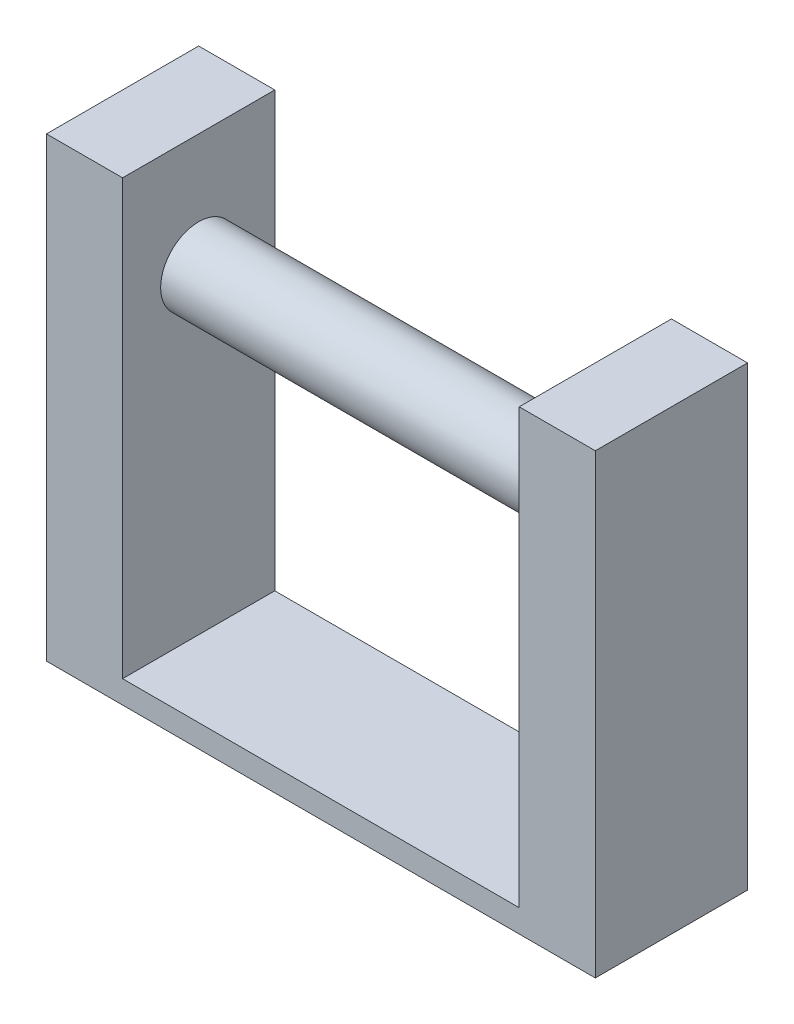
ISO-10303-21;
HEADER;
FILE_DESCRIPTION(('STEP AP214'),'2;1');
FILE_NAME('part.step','',(''),(''),'','','');
FILE_SCHEMA(('AUTOMOTIVE_DESIGN { 1 0 10303 214 1 1 1 1 }'));
ENDSEC;
DATA;
#1=APPLICATION_CONTEXT('core data for automotive mechanical design processes');
#2=APPLICATION_PROTOCOL_DEFINITION('international standard','automotive_design',2000,#1);
#3=PRODUCT_CONTEXT('',#1,'mechanical');
#4=PRODUCT('Part','Part','',(#3));
#5=PRODUCT_RELATED_PRODUCT_CATEGORY('part','',(#4));
#6=PRODUCT_DEFINITION_FORMATION('','',#4);
#7=PRODUCT_DEFINITION_CONTEXT('part definition',#1,'design');
#8=PRODUCT_DEFINITION('design','',#6,#7);
#9=PRODUCT_DEFINITION_SHAPE('','',#8);
#10=(LENGTH_UNIT() NAMED_UNIT(*) SI_UNIT(.MILLI.,.METRE.));
#11=(NAMED_UNIT(*) PLANE_ANGLE_UNIT() SI_UNIT($,.RADIAN.));
#12=(NAMED_UNIT(*) SI_UNIT($,.STERADIAN.) SOLID_ANGLE_UNIT());
#13=UNCERTAINTY_MEASURE_WITH_UNIT(LENGTH_MEASURE(1.E-05),#10,'distance_accuracy_value','');
#14=(GEOMETRIC_REPRESENTATION_CONTEXT(3) GLOBAL_UNCERTAINTY_ASSIGNED_CONTEXT((#13)) GLOBAL_UNIT_ASSIGNED_CONTEXT((#10,
#11,#12)) REPRESENTATION_CONTEXT('',''));
#15=CARTESIAN_POINT('',(0.,0.,0.));
#16=DIRECTION('',(0.,0.,1.));
#17=DIRECTION('',(1.,0.,0.));
#18=AXIS2_PLACEMENT_3D('',#15,#16,#17);
#19=CARTESIAN_POINT('',(-41.6981911266425,23.0571240586059,20.));
#20=DIRECTION('',(0.,-1.,0.));
#21=DIRECTION('',(0.,0.,-1.));
#22=AXIS2_PLACEMENT_3D('',#19,#20,#21);
#23=PLANE('',#22);
#24=DIRECTION('',(-1.,0.,0.));
#25=VECTOR('',#24,1.);
#26=CARTESIAN_POINT('',(-41.6981911266425,23.0571240586059,0.));
#27=LINE('',#26,#25);
#28=CARTESIAN_POINT('',(-41.6981911266425,23.0571240586059,0.));
#29=VERTEX_POINT('',#28);
#30=CARTESIAN_POINT('',(-51.6981911266425,23.0571240586059,0.));
#31=VERTEX_POINT('',#30);
#32=EDGE_CURVE('E130',#29,#31,#27,.T.);
#33=ORIENTED_EDGE('',*,*,#32,.T.);
#34=DIRECTION('',(0.,0.,-1.));
#35=VECTOR('',#34,1.);
#36=CARTESIAN_POINT('',(-51.6981911266425,23.0571240586059,20.));
#37=LINE('',#36,#35);
#38=CARTESIAN_POINT('',(-51.6981911266425,23.0571240586059,20.));
#39=VERTEX_POINT('',#38);
#40=EDGE_CURVE('E11',#39,#31,#37,.T.);
#41=ORIENTED_EDGE('',*,*,#40,.F.);
#42=DIRECTION('',(-1.,0.,0.));
#43=VECTOR('',#42,1.);
#44=CARTESIAN_POINT('',(-41.6981911266425,23.0571240586059,20.));
#45=LINE('',#44,#43);
#46=CARTESIAN_POINT('',(-41.6981911266425,23.0571240586059,20.));
#47=VERTEX_POINT('',#46);
#48=EDGE_CURVE('E145',#47,#39,#45,.T.);
#49=ORIENTED_EDGE('',*,*,#48,.F.);
#50=DIRECTION('',(0.,0.,-1.));
#51=VECTOR('',#50,1.);
#52=CARTESIAN_POINT('',(-41.6981911266425,23.0571240586059,20.));
#53=LINE('',#52,#51);
#54=EDGE_CURVE('E126',#47,#29,#53,.T.);
#55=ORIENTED_EDGE('',*,*,#54,.T.);
#56=EDGE_LOOP('',(#33,#41,#49,#55));
#57=FACE_BOUND('',#56,.T.);
#58=ADVANCED_FACE('F33',(#57),#23,.F.);
#59=CARTESIAN_POINT('',(-51.6981911266425,23.0571240586059,20.));
#60=DIRECTION('',(1.,0.,0.));
#61=DIRECTION('',(0.,1.,0.));
#62=AXIS2_PLACEMENT_3D('',#59,#60,#61);
#63=PLANE('',#62);
#64=DIRECTION('',(0.,-1.,0.));
#65=VECTOR('',#64,1.);
#66=CARTESIAN_POINT('',(-51.6981911266425,23.0571240586059,0.));
#67=LINE('',#66,#65);
#68=CARTESIAN_POINT('',(-51.6981911266425,-36.942875941394,0.));
#69=VERTEX_POINT('',#68);
#70=EDGE_CURVE('E133',#31,#69,#67,.T.);
#71=ORIENTED_EDGE('',*,*,#70,.T.);
#72=DIRECTION('',(0.,0.,-1.));
#73=VECTOR('',#72,1.);
#74=CARTESIAN_POINT('',(-51.6981911266425,-36.942875941394,20.));
#75=LINE('',#74,#73);
#76=CARTESIAN_POINT('',(-51.6981911266425,-36.942875941394,20.));
#77=VERTEX_POINT('',#76);
#78=EDGE_CURVE('E42',#77,#69,#75,.T.);
#79=ORIENTED_EDGE('',*,*,#78,.F.);
#80=DIRECTION('',(0.,-1.,0.));
#81=VECTOR('',#80,1.);
#82=CARTESIAN_POINT('',(-51.6981911266425,23.0571240586059,20.));
#83=LINE('',#82,#81);
#84=EDGE_CURVE('E93',#39,#77,#83,.T.);
#85=ORIENTED_EDGE('',*,*,#84,.F.);
#86=ORIENTED_EDGE('',*,*,#40,.T.);
#87=EDGE_LOOP('',(#71,#79,#85,#86));
#88=FACE_BOUND('',#87,.T.);
#89=ADVANCED_FACE('F197',(#88),#63,.F.);
#90=CARTESIAN_POINT('',(-51.6981911266425,-36.942875941394,20.));
#91=DIRECTION('',(0.,1.,0.));
#92=DIRECTION('',(0.,0.,1.));
#93=AXIS2_PLACEMENT_3D('',#90,#91,#92);
#94=PLANE('',#93);
#95=DIRECTION('',(1.,0.,0.));
#96=VECTOR('',#95,1.);
#97=CARTESIAN_POINT('',(-51.6981911266425,-36.942875941394,0.));
#98=LINE('',#97,#96);
#99=CARTESIAN_POINT('',(20.4223877168278,-36.942875941394,0.));
#100=VERTEX_POINT('',#99);
#101=EDGE_CURVE('E136',#69,#100,#98,.T.);
#102=ORIENTED_EDGE('',*,*,#101,.T.);
#103=DIRECTION('',(0.,0.,-1.));
#104=VECTOR('',#103,1.);
#105=CARTESIAN_POINT('',(20.4223877168278,-36.942875941394,20.));
#106=LINE('',#105,#104);
#107=CARTESIAN_POINT('',(20.4223877168278,-36.942875941394,20.));
#108=VERTEX_POINT('',#107);
#109=EDGE_CURVE('E152',#108,#100,#106,.T.);
#110=ORIENTED_EDGE('',*,*,#109,.F.);
#111=DIRECTION('',(1.,0.,0.));
#112=VECTOR('',#111,1.);
#113=CARTESIAN_POINT('',(-51.6981911266425,-36.942875941394,20.));
#114=LINE('',#113,#112);
#115=EDGE_CURVE('E161',#77,#108,#114,.T.);
#116=ORIENTED_EDGE('',*,*,#115,.F.);
#117=ORIENTED_EDGE('',*,*,#78,.T.);
#118=EDGE_LOOP('',(#102,#110,#116,#117));
#119=FACE_BOUND('',#118,.T.);
#120=ADVANCED_FACE('F159',(#119),#94,.F.);
#121=CARTESIAN_POINT('',(20.4223877168278,-36.942875941394,20.));
#122=DIRECTION('',(-1.,0.,0.));
#123=DIRECTION('',(0.,0.,1.));
#124=AXIS2_PLACEMENT_3D('',#121,#122,#123);
#125=PLANE('',#124);
#126=DIRECTION('',(0.,1.,0.));
#127=VECTOR('',#126,1.);
#128=CARTESIAN_POINT('',(20.4223877168278,-36.942875941394,0.));
#129=LINE('',#128,#127);
#130=CARTESIAN_POINT('',(20.4223877168278,23.0571240586059,0.));
#131=VERTEX_POINT('',#130);
#132=EDGE_CURVE('E138',#100,#131,#129,.T.);
#133=ORIENTED_EDGE('',*,*,#132,.T.);
#134=DIRECTION('',(0.,0.,-1.));
#135=VECTOR('',#134,1.);
#136=CARTESIAN_POINT('',(20.4223877168278,23.0571240586059,20.));
#137=LINE('',#136,#135);
#138=CARTESIAN_POINT('',(20.4223877168278,23.0571240586059,20.));
#139=VERTEX_POINT('',#138);
#140=EDGE_CURVE('E149',#139,#131,#137,.T.);
#141=ORIENTED_EDGE('',*,*,#140,.F.);
#142=DIRECTION('',(0.,1.,0.));
#143=VECTOR('',#142,1.);
#144=CARTESIAN_POINT('',(20.4223877168278,-36.942875941394,20.));
#145=LINE('',#144,#143);
#146=EDGE_CURVE('E173',#108,#139,#145,.T.);
#147=ORIENTED_EDGE('',*,*,#146,.F.);
#148=ORIENTED_EDGE('',*,*,#109,.T.);
#149=EDGE_LOOP('',(#133,#141,#147,#148));
#150=FACE_BOUND('',#149,.T.);
#151=ADVANCED_FACE('F169',(#150),#125,.F.);
#152=CARTESIAN_POINT('',(20.4223877168278,23.0571240586059,20.));
#153=DIRECTION('',(0.,-1.,0.));
#154=DIRECTION('',(0.,0.,-1.));
#155=AXIS2_PLACEMENT_3D('',#152,#153,#154);
#156=PLANE('',#155);
#157=DIRECTION('',(-1.,0.,0.));
#158=VECTOR('',#157,1.);
#159=CARTESIAN_POINT('',(20.4223877168278,23.0571240586059,0.));
#160=LINE('',#159,#158);
#161=CARTESIAN_POINT('',(10.4223877168278,23.0571240586059,0.));
#162=VERTEX_POINT('',#161);
#163=EDGE_CURVE('E140',#131,#162,#160,.T.);
#164=ORIENTED_EDGE('',*,*,#163,.T.);
#165=DIRECTION('',(0.,0.,-1.));
#166=VECTOR('',#165,1.);
#167=CARTESIAN_POINT('',(10.4223877168278,23.0571240586059,20.));
#168=LINE('',#167,#166);
#169=CARTESIAN_POINT('',(10.4223877168278,23.0571240586059,20.));
#170=VERTEX_POINT('',#169);
#171=EDGE_CURVE('E121',#170,#162,#168,.T.);
#172=ORIENTED_EDGE('',*,*,#171,.F.);
#173=DIRECTION('',(-1.,0.,0.));
#174=VECTOR('',#173,1.);
#175=CARTESIAN_POINT('',(20.4223877168278,23.0571240586059,20.));
#176=LINE('',#175,#174);
#177=EDGE_CURVE('E112',#139,#170,#176,.T.);
#178=ORIENTED_EDGE('',*,*,#177,.F.);
#179=ORIENTED_EDGE('',*,*,#140,.T.);
#180=EDGE_LOOP('',(#164,#172,#178,#179));
#181=FACE_BOUND('',#180,.T.);
#182=ADVANCED_FACE('F172',(#181),#156,.F.);
#183=CARTESIAN_POINT('',(10.4223877168278,23.0571240586059,20.));
#184=DIRECTION('',(1.,0.,0.));
#185=DIRECTION('',(0.,1.,0.));
#186=AXIS2_PLACEMENT_3D('',#183,#184,#185);
#187=PLANE('',#186);
#188=CARTESIAN_POINT('',(10.4223877168278,8.05712405860594,10.));
#189=DIRECTION('',(1.,0.,0.));
#190=DIRECTION('',(0.,1.,0.));
#191=AXIS2_PLACEMENT_3D('',#188,#189,#190);
#192=CIRCLE('',#191,5.);
#193=CARTESIAN_POINT('',(10.4223877168278,13.0571240586059,10.));
#194=VERTEX_POINT('',#193);
#195=EDGE_CURVE('E134',#194,#194,#192,.T.);
#196=ORIENTED_EDGE('',*,*,#195,.T.);
#197=EDGE_LOOP('',(#196));
#198=FACE_BOUND('',#197,.T.);
#199=DIRECTION('',(0.,-1.,0.));
#200=VECTOR('',#199,1.);
#201=CARTESIAN_POINT('',(10.4223877168278,23.0571240586059,0.));
#202=LINE('',#201,#200);
#203=CARTESIAN_POINT('',(10.4223877168278,-33.942875941394,0.));
#204=VERTEX_POINT('',#203);
#205=EDGE_CURVE('E120',#162,#204,#202,.T.);
#206=ORIENTED_EDGE('',*,*,#205,.T.);
#207=DIRECTION('',(0.,0.,-1.));
#208=VECTOR('',#207,1.);
#209=CARTESIAN_POINT('',(10.4223877168278,-33.942875941394,20.));
#210=LINE('',#209,#208);
#211=CARTESIAN_POINT('',(10.4223877168278,-33.942875941394,20.));
#212=VERTEX_POINT('',#211);
#213=EDGE_CURVE('E117',#212,#204,#210,.T.);
#214=ORIENTED_EDGE('',*,*,#213,.F.);
#215=DIRECTION('',(0.,-1.,0.));
#216=VECTOR('',#215,1.);
#217=CARTESIAN_POINT('',(10.4223877168278,23.0571240586059,20.));
#218=LINE('',#217,#216);
#219=EDGE_CURVE('E106',#170,#212,#218,.T.);
#220=ORIENTED_EDGE('',*,*,#219,.F.);
#221=ORIENTED_EDGE('',*,*,#171,.T.);
#222=EDGE_LOOP('',(#206,#214,#220,#221));
#223=FACE_BOUND('',#222,.T.);
#224=ADVANCED_FACE('F118',(#198,#223),#187,.F.);
#225=CARTESIAN_POINT('',(10.4223877168278,-33.942875941394,20.));
#226=DIRECTION('',(0.,-1.,0.));
#227=DIRECTION('',(1.,0.,0.));
#228=AXIS2_PLACEMENT_3D('',#225,#226,#227);
#229=PLANE('',#228);
#230=DIRECTION('',(-1.,0.,0.));
#231=VECTOR('',#230,1.);
#232=CARTESIAN_POINT('',(10.4223877168278,-33.942875941394,0.));
#233=LINE('',#232,#231);
#234=CARTESIAN_POINT('',(-41.6981911266425,-33.9428759413941,0.));
#235=VERTEX_POINT('',#234);
#236=EDGE_CURVE('E79',#204,#235,#233,.T.);
#237=ORIENTED_EDGE('',*,*,#236,.T.);
#238=DIRECTION('',(0.,0.,-1.));
#239=VECTOR('',#238,1.);
#240=CARTESIAN_POINT('',(-41.6981911266425,-33.9428759413941,20.));
#241=LINE('',#240,#239);
#242=CARTESIAN_POINT('',(-41.6981911266425,-33.9428759413941,20.));
#243=VERTEX_POINT('',#242);
#244=EDGE_CURVE('E122',#243,#235,#241,.T.);
#245=ORIENTED_EDGE('',*,*,#244,.F.);
#246=DIRECTION('',(-1.,0.,0.));
#247=VECTOR('',#246,1.);
#248=CARTESIAN_POINT('',(10.4223877168278,-33.942875941394,20.));
#249=LINE('',#248,#247);
#250=EDGE_CURVE('E110',#212,#243,#249,.T.);
#251=ORIENTED_EDGE('',*,*,#250,.F.);
#252=ORIENTED_EDGE('',*,*,#213,.T.);
#253=EDGE_LOOP('',(#237,#245,#251,#252));
#254=FACE_BOUND('',#253,.T.);
#255=ADVANCED_FACE('F124',(#254),#229,.F.);
#256=CARTESIAN_POINT('',(-41.6981911266425,-33.9428759413941,20.));
#257=DIRECTION('',(-1.,0.,0.));
#258=DIRECTION('',(0.,0.,1.));
#259=AXIS2_PLACEMENT_3D('',#256,#257,#258);
#260=PLANE('',#259);
#261=CARTESIAN_POINT('',(-41.6981911266425,8.05712405860594,10.));
#262=DIRECTION('',(-1.,0.,0.));
#263=DIRECTION('',(0.,0.,1.));
#264=AXIS2_PLACEMENT_3D('',#261,#262,#263);
#265=CIRCLE('',#264,5.);
#266=CARTESIAN_POINT('',(-41.6981911266425,8.05712405860594,15.));
#267=VERTEX_POINT('',#266);
#268=EDGE_CURVE('E36',#267,#267,#265,.T.);
#269=ORIENTED_EDGE('',*,*,#268,.T.);
#270=EDGE_LOOP('',(#269));
#271=FACE_BOUND('',#270,.T.);
#272=DIRECTION('',(0.,1.,0.));
#273=VECTOR('',#272,1.);
#274=CARTESIAN_POINT('',(-41.6981911266425,-33.9428759413941,0.));
#275=LINE('',#274,#273);
#276=EDGE_CURVE('E85',#235,#29,#275,.T.);
#277=ORIENTED_EDGE('',*,*,#276,.T.);
#278=ORIENTED_EDGE('',*,*,#54,.F.);
#279=DIRECTION('',(0.,1.,0.));
#280=VECTOR('',#279,1.);
#281=CARTESIAN_POINT('',(-41.6981911266425,-33.9428759413941,20.));
#282=LINE('',#281,#280);
#283=EDGE_CURVE('E50',#243,#47,#282,.T.);
#284=ORIENTED_EDGE('',*,*,#283,.F.);
#285=ORIENTED_EDGE('',*,*,#244,.T.);
#286=EDGE_LOOP('',(#277,#278,#284,#285));
#287=FACE_BOUND('',#286,.T.);
#288=ADVANCED_FACE('F185',(#271,#287),#260,.F.);
#289=CARTESIAN_POINT('',(0.,0.,20.));
#290=DIRECTION('',(0.,0.,1.));
#291=DIRECTION('',(1.,0.,0.));
#292=AXIS2_PLACEMENT_3D('',#289,#290,#291);
#293=PLANE('',#292);
#294=ORIENTED_EDGE('',*,*,#48,.T.);
#295=ORIENTED_EDGE('',*,*,#84,.T.);
#296=ORIENTED_EDGE('',*,*,#115,.T.);
#297=ORIENTED_EDGE('',*,*,#146,.T.);
#298=ORIENTED_EDGE('',*,*,#177,.T.);
#299=ORIENTED_EDGE('',*,*,#219,.T.);
#300=ORIENTED_EDGE('',*,*,#250,.T.);
#301=ORIENTED_EDGE('',*,*,#283,.T.);
#302=EDGE_LOOP('',(#294,#295,#296,#297,#298,#299,#300,#301));
#303=FACE_BOUND('',#302,.T.);
#304=ADVANCED_FACE('F108',(#303),#293,.T.);
#305=CARTESIAN_POINT('',(0.,0.,0.));
#306=DIRECTION('',(0.,0.,1.));
#307=DIRECTION('',(1.,0.,0.));
#308=AXIS2_PLACEMENT_3D('',#305,#306,#307);
#309=PLANE('',#308);
#310=ORIENTED_EDGE('',*,*,#32,.F.);
#311=ORIENTED_EDGE('',*,*,#276,.F.);
#312=ORIENTED_EDGE('',*,*,#236,.F.);
#313=ORIENTED_EDGE('',*,*,#205,.F.);
#314=ORIENTED_EDGE('',*,*,#163,.F.);
#315=ORIENTED_EDGE('',*,*,#132,.F.);
#316=ORIENTED_EDGE('',*,*,#101,.F.);
#317=ORIENTED_EDGE('',*,*,#70,.F.);
#318=EDGE_LOOP('',(#310,#311,#312,#313,#314,#315,#316,#317));
#319=FACE_BOUND('',#318,.T.);
#320=ADVANCED_FACE('F165',(#319),#309,.F.);
#321=CARTESIAN_POINT('',(-51.6981911266425,8.05712405860594,10.));
#322=DIRECTION('',(1.,0.,0.));
#323=DIRECTION('',(0.,0.,-1.));
#324=AXIS2_PLACEMENT_3D('',#321,#322,#323);
#325=CYLINDRICAL_SURFACE('',#324,5.);
#326=ORIENTED_EDGE('',*,*,#268,.F.);
#327=EDGE_LOOP('',(#326));
#328=FACE_BOUND('',#327,.T.);
#329=ORIENTED_EDGE('',*,*,#195,.F.);
#330=EDGE_LOOP('',(#329));
#331=FACE_BOUND('',#330,.T.);
#332=ADVANCED_FACE('F187',(#328,#331),#325,.T.);
#333=CLOSED_SHELL('',(#58,#89,#120,#151,#182,#224,#255,#288,#304,#320,#332));
#334=MANIFOLD_SOLID_BREP('B2',#333);
#335=ADVANCED_BREP_SHAPE_REPRESENTATION('',(#18,#334),#14);
#336=SHAPE_DEFINITION_REPRESENTATION(#9,#335);
ENDSEC;
END-ISO-10303-21;
